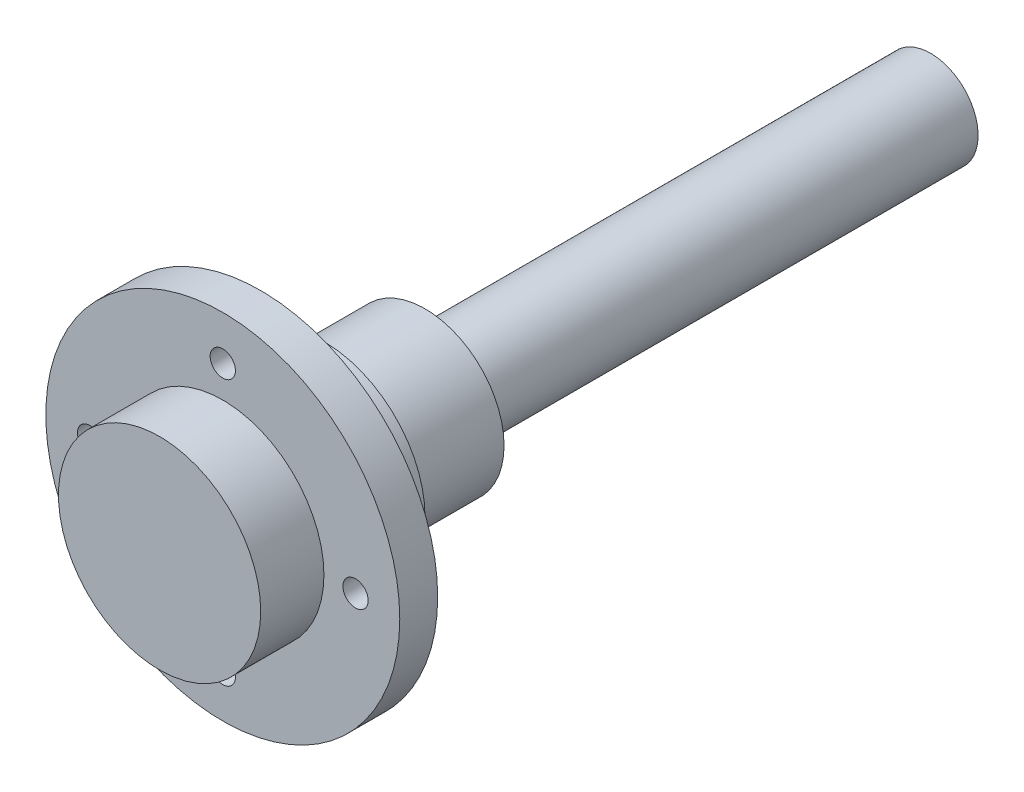
ISO-10303-21;
HEADER;
FILE_DESCRIPTION(('STEP AP214'),'2;1');
FILE_NAME('part.step','',(''),(''),'','','');
FILE_SCHEMA(('AUTOMOTIVE_DESIGN { 1 0 10303 214 1 1 1 1 }'));
ENDSEC;
DATA;
#1=APPLICATION_CONTEXT('core data for automotive mechanical design processes');
#2=APPLICATION_PROTOCOL_DEFINITION('international standard','automotive_design',2000,#1);
#3=PRODUCT_CONTEXT('',#1,'mechanical');
#4=PRODUCT('Part','Part','',(#3));
#5=PRODUCT_RELATED_PRODUCT_CATEGORY('part','',(#4));
#6=PRODUCT_DEFINITION_FORMATION('','',#4);
#7=PRODUCT_DEFINITION_CONTEXT('part definition',#1,'design');
#8=PRODUCT_DEFINITION('design','',#6,#7);
#9=PRODUCT_DEFINITION_SHAPE('','',#8);
#10=(LENGTH_UNIT() NAMED_UNIT(*) SI_UNIT(.MILLI.,.METRE.));
#11=(NAMED_UNIT(*) PLANE_ANGLE_UNIT() SI_UNIT($,.RADIAN.));
#12=(NAMED_UNIT(*) SI_UNIT($,.STERADIAN.) SOLID_ANGLE_UNIT());
#13=UNCERTAINTY_MEASURE_WITH_UNIT(LENGTH_MEASURE(1.E-05),#10,'distance_accuracy_value','');
#14=(GEOMETRIC_REPRESENTATION_CONTEXT(3) GLOBAL_UNCERTAINTY_ASSIGNED_CONTEXT((#13)) GLOBAL_UNIT_ASSIGNED_CONTEXT((#10,
#11,#12)) REPRESENTATION_CONTEXT('',''));
#15=CARTESIAN_POINT('',(0.,0.,0.));
#16=DIRECTION('',(0.,0.,1.));
#17=DIRECTION('',(1.,0.,0.));
#18=AXIS2_PLACEMENT_3D('',#15,#16,#17);
#19=CARTESIAN_POINT('',(0.,0.,16.));
#20=DIRECTION('',(0.,0.,-1.));
#21=DIRECTION('',(-1.,0.,0.));
#22=AXIS2_PLACEMENT_3D('',#19,#20,#21);
#23=CYLINDRICAL_SURFACE('',#22,12.5);
#24=CARTESIAN_POINT('',(0.,0.,16.));
#25=DIRECTION('',(0.,0.,1.));
#26=DIRECTION('',(1.,0.,0.));
#27=AXIS2_PLACEMENT_3D('',#24,#25,#26);
#28=CIRCLE('',#27,12.5);
#29=CARTESIAN_POINT('',(12.5,0.,16.));
#30=VERTEX_POINT('',#29);
#31=EDGE_CURVE('E47',#30,#30,#28,.T.);
#32=ORIENTED_EDGE('',*,*,#31,.F.);
#33=EDGE_LOOP('',(#32));
#34=FACE_BOUND('',#33,.T.);
#35=CARTESIAN_POINT('',(0.,0.,0.));
#36=DIRECTION('',(0.,0.,1.));
#37=DIRECTION('',(1.,0.,0.));
#38=AXIS2_PLACEMENT_3D('',#35,#36,#37);
#39=CIRCLE('',#38,12.5);
#40=CARTESIAN_POINT('',(12.5,0.,0.));
#41=VERTEX_POINT('',#40);
#42=EDGE_CURVE('E42',#41,#41,#39,.T.);
#43=ORIENTED_EDGE('',*,*,#42,.T.);
#44=EDGE_LOOP('',(#43));
#45=FACE_BOUND('',#44,.T.);
#46=ADVANCED_FACE('F39',(#34,#45),#23,.T.);
#47=CARTESIAN_POINT('',(0.,0.,0.));
#48=DIRECTION('',(0.,0.,1.));
#49=DIRECTION('',(1.,0.,0.));
#50=AXIS2_PLACEMENT_3D('',#47,#48,#49);
#51=PLANE('',#50);
#52=CARTESIAN_POINT('',(0.,0.,0.));
#53=DIRECTION('',(0.,0.,-1.));
#54=DIRECTION('',(-1.,0.,0.));
#55=AXIS2_PLACEMENT_3D('',#52,#53,#54);
#56=CIRCLE('',#55,7.5);
#57=CARTESIAN_POINT('',(-7.5,0.,0.));
#58=VERTEX_POINT('',#57);
#59=EDGE_CURVE('E10',#58,#58,#56,.T.);
#60=ORIENTED_EDGE('',*,*,#59,.F.);
#61=EDGE_LOOP('',(#60));
#62=FACE_BOUND('',#61,.T.);
#63=ORIENTED_EDGE('',*,*,#42,.F.);
#64=EDGE_LOOP('',(#63));
#65=FACE_BOUND('',#64,.T.);
#66=ADVANCED_FACE('F127',(#62,#65),#51,.F.);
#67=CARTESIAN_POINT('',(0.,0.,26.));
#68=DIRECTION('',(0.,0.,-1.));
#69=DIRECTION('',(-1.,0.,0.));
#70=AXIS2_PLACEMENT_3D('',#67,#68,#69);
#71=CYLINDRICAL_SURFACE('',#70,16.);
#72=CARTESIAN_POINT('',(0.,0.,26.));
#73=DIRECTION('',(0.,0.,1.));
#74=DIRECTION('',(1.,0.,0.));
#75=AXIS2_PLACEMENT_3D('',#72,#73,#74);
#76=CIRCLE('',#75,16.);
#77=CARTESIAN_POINT('',(16.,0.,26.));
#78=VERTEX_POINT('',#77);
#79=EDGE_CURVE('E105',#78,#78,#76,.T.);
#80=ORIENTED_EDGE('',*,*,#79,.F.);
#81=EDGE_LOOP('',(#80));
#82=FACE_BOUND('',#81,.T.);
#83=CARTESIAN_POINT('',(0.,0.,16.));
#84=DIRECTION('',(0.,0.,1.));
#85=DIRECTION('',(1.,0.,0.));
#86=AXIS2_PLACEMENT_3D('',#83,#84,#85);
#87=CIRCLE('',#86,16.);
#88=CARTESIAN_POINT('',(16.,0.,16.));
#89=VERTEX_POINT('',#88);
#90=EDGE_CURVE('E101',#89,#89,#87,.T.);
#91=ORIENTED_EDGE('',*,*,#90,.T.);
#92=EDGE_LOOP('',(#91));
#93=FACE_BOUND('',#92,.T.);
#94=ADVANCED_FACE('F113',(#82,#93),#71,.T.);
#95=CARTESIAN_POINT('',(0.,0.,16.));
#96=DIRECTION('',(0.,0.,1.));
#97=DIRECTION('',(1.,0.,0.));
#98=AXIS2_PLACEMENT_3D('',#95,#96,#97);
#99=PLANE('',#98);
#100=ORIENTED_EDGE('',*,*,#31,.T.);
#101=EDGE_LOOP('',(#100));
#102=FACE_BOUND('',#101,.T.);
#103=ORIENTED_EDGE('',*,*,#90,.F.);
#104=EDGE_LOOP('',(#103));
#105=FACE_BOUND('',#104,.T.);
#106=ADVANCED_FACE('F115',(#102,#105),#99,.F.);
#107=CARTESIAN_POINT('',(0.,0.,32.));
#108=DIRECTION('',(0.,0.,-1.));
#109=DIRECTION('',(-1.,0.,0.));
#110=AXIS2_PLACEMENT_3D('',#107,#108,#109);
#111=CYLINDRICAL_SURFACE('',#110,28.);
#112=CARTESIAN_POINT('',(0.,0.,32.));
#113=DIRECTION('',(0.,0.,1.));
#114=DIRECTION('',(1.,0.,0.));
#115=AXIS2_PLACEMENT_3D('',#112,#113,#114);
#116=CIRCLE('',#115,28.);
#117=CARTESIAN_POINT('',(28.,0.,32.));
#118=VERTEX_POINT('',#117);
#119=EDGE_CURVE('E97',#118,#118,#116,.T.);
#120=ORIENTED_EDGE('',*,*,#119,.F.);
#121=EDGE_LOOP('',(#120));
#122=FACE_BOUND('',#121,.T.);
#123=CARTESIAN_POINT('',(0.,0.,26.));
#124=DIRECTION('',(0.,0.,1.));
#125=DIRECTION('',(1.,0.,0.));
#126=AXIS2_PLACEMENT_3D('',#123,#124,#125);
#127=CIRCLE('',#126,28.);
#128=CARTESIAN_POINT('',(28.,0.,26.));
#129=VERTEX_POINT('',#128);
#130=EDGE_CURVE('E96',#129,#129,#127,.T.);
#131=ORIENTED_EDGE('',*,*,#130,.T.);
#132=EDGE_LOOP('',(#131));
#133=FACE_BOUND('',#132,.T.);
#134=ADVANCED_FACE('F117',(#122,#133),#111,.T.);
#135=CARTESIAN_POINT('',(0.,0.,32.));
#136=DIRECTION('',(0.,0.,1.));
#137=DIRECTION('',(1.,0.,0.));
#138=AXIS2_PLACEMENT_3D('',#135,#136,#137);
#139=PLANE('',#138);
#140=CARTESIAN_POINT('',(0.,0.,32.));
#141=DIRECTION('',(0.,0.,1.));
#142=DIRECTION('',(1.,0.,0.));
#143=AXIS2_PLACEMENT_3D('',#140,#141,#142);
#144=CIRCLE('',#143,16.);
#145=CARTESIAN_POINT('',(16.,0.,32.));
#146=VERTEX_POINT('',#145);
#147=EDGE_CURVE('E61',#146,#146,#144,.T.);
#148=ORIENTED_EDGE('',*,*,#147,.F.);
#149=EDGE_LOOP('',(#148));
#150=FACE_BOUND('',#149,.T.);
#151=CARTESIAN_POINT('',(-21.,0.,32.));
#152=DIRECTION('',(0.,0.,1.));
#153=DIRECTION('',(1.,0.,0.));
#154=AXIS2_PLACEMENT_3D('',#151,#152,#153);
#155=CIRCLE('',#154,2.);
#156=CARTESIAN_POINT('',(-19.,0.,32.));
#157=VERTEX_POINT('',#156);
#158=EDGE_CURVE('E84',#157,#157,#155,.T.);
#159=ORIENTED_EDGE('',*,*,#158,.F.);
#160=EDGE_LOOP('',(#159));
#161=FACE_BOUND('',#160,.T.);
#162=CARTESIAN_POINT('',(0.,-21.,32.));
#163=DIRECTION('',(0.,0.,1.));
#164=DIRECTION('',(1.,0.,0.));
#165=AXIS2_PLACEMENT_3D('',#162,#163,#164);
#166=CIRCLE('',#165,2.);
#167=CARTESIAN_POINT('',(2.,-21.,32.));
#168=VERTEX_POINT('',#167);
#169=EDGE_CURVE('E80',#168,#168,#166,.T.);
#170=ORIENTED_EDGE('',*,*,#169,.F.);
#171=EDGE_LOOP('',(#170));
#172=FACE_BOUND('',#171,.T.);
#173=CARTESIAN_POINT('',(21.,2.19963324347117E-13,32.));
#174=DIRECTION('',(0.,0.,1.));
#175=DIRECTION('',(1.,0.,0.));
#176=AXIS2_PLACEMENT_3D('',#173,#174,#175);
#177=CIRCLE('',#176,2.);
#178=CARTESIAN_POINT('',(23.,2.19963324347117E-13,32.));
#179=VERTEX_POINT('',#178);
#180=EDGE_CURVE('E69',#179,#179,#177,.T.);
#181=ORIENTED_EDGE('',*,*,#180,.F.);
#182=EDGE_LOOP('',(#181));
#183=FACE_BOUND('',#182,.T.);
#184=CARTESIAN_POINT('',(0.,21.,32.));
#185=DIRECTION('',(0.,0.,1.));
#186=DIRECTION('',(1.,0.,0.));
#187=AXIS2_PLACEMENT_3D('',#184,#185,#186);
#188=CIRCLE('',#187,2.);
#189=CARTESIAN_POINT('',(2.,21.,32.));
#190=VERTEX_POINT('',#189);
#191=EDGE_CURVE('E92',#190,#190,#188,.T.);
#192=ORIENTED_EDGE('',*,*,#191,.F.);
#193=EDGE_LOOP('',(#192));
#194=FACE_BOUND('',#193,.T.);
#195=ORIENTED_EDGE('',*,*,#119,.T.);
#196=EDGE_LOOP('',(#195));
#197=FACE_BOUND('',#196,.T.);
#198=ADVANCED_FACE('F124',(#150,#161,#172,#183,#194,#197),#139,.T.);
#199=CARTESIAN_POINT('',(0.,0.,26.));
#200=DIRECTION('',(0.,0.,1.));
#201=DIRECTION('',(1.,0.,0.));
#202=AXIS2_PLACEMENT_3D('',#199,#200,#201);
#203=PLANE('',#202);
#204=CARTESIAN_POINT('',(-21.,0.,26.));
#205=DIRECTION('',(0.,0.,-1.));
#206=DIRECTION('',(0.,-1.,0.));
#207=AXIS2_PLACEMENT_3D('',#204,#205,#206);
#208=CIRCLE('',#207,2.);
#209=CARTESIAN_POINT('',(-21.,-2.00000000000007,26.));
#210=VERTEX_POINT('',#209);
#211=EDGE_CURVE('E65',#210,#210,#208,.T.);
#212=ORIENTED_EDGE('',*,*,#211,.F.);
#213=EDGE_LOOP('',(#212));
#214=FACE_BOUND('',#213,.T.);
#215=CARTESIAN_POINT('',(0.,-21.,26.));
#216=DIRECTION('',(0.,0.,-1.));
#217=DIRECTION('',(1.,0.,0.));
#218=AXIS2_PLACEMENT_3D('',#215,#216,#217);
#219=CIRCLE('',#218,2.);
#220=CARTESIAN_POINT('',(2.,-21.,26.));
#221=VERTEX_POINT('',#220);
#222=EDGE_CURVE('E70',#221,#221,#219,.T.);
#223=ORIENTED_EDGE('',*,*,#222,.F.);
#224=EDGE_LOOP('',(#223));
#225=FACE_BOUND('',#224,.T.);
#226=CARTESIAN_POINT('',(21.,2.19963324347117E-13,26.));
#227=DIRECTION('',(0.,0.,-1.));
#228=DIRECTION('',(0.,1.,0.));
#229=AXIS2_PLACEMENT_3D('',#226,#227,#228);
#230=CIRCLE('',#229,2.);
#231=CARTESIAN_POINT('',(21.,2.00000000000022,26.));
#232=VERTEX_POINT('',#231);
#233=EDGE_CURVE('E60',#232,#232,#230,.T.);
#234=ORIENTED_EDGE('',*,*,#233,.F.);
#235=EDGE_LOOP('',(#234));
#236=FACE_BOUND('',#235,.T.);
#237=CARTESIAN_POINT('',(0.,21.,26.));
#238=DIRECTION('',(0.,0.,-1.));
#239=DIRECTION('',(-1.,0.,0.));
#240=AXIS2_PLACEMENT_3D('',#237,#238,#239);
#241=CIRCLE('',#240,2.);
#242=CARTESIAN_POINT('',(-2.,21.,26.));
#243=VERTEX_POINT('',#242);
#244=EDGE_CURVE('E88',#243,#243,#241,.T.);
#245=ORIENTED_EDGE('',*,*,#244,.F.);
#246=EDGE_LOOP('',(#245));
#247=FACE_BOUND('',#246,.T.);
#248=ORIENTED_EDGE('',*,*,#79,.T.);
#249=EDGE_LOOP('',(#248));
#250=FACE_BOUND('',#249,.T.);
#251=ORIENTED_EDGE('',*,*,#130,.F.);
#252=EDGE_LOOP('',(#251));
#253=FACE_BOUND('',#252,.T.);
#254=ADVANCED_FACE('F175',(#214,#225,#236,#247,#250,#253),#203,.F.);
#255=CARTESIAN_POINT('',(0.,21.,36.));
#256=DIRECTION('',(0.,0.,-1.));
#257=DIRECTION('',(-1.,0.,0.));
#258=AXIS2_PLACEMENT_3D('',#255,#256,#257);
#259=CYLINDRICAL_SURFACE('',#258,2.);
#260=ORIENTED_EDGE('',*,*,#191,.T.);
#261=EDGE_LOOP('',(#260));
#262=FACE_BOUND('',#261,.T.);
#263=ORIENTED_EDGE('',*,*,#244,.T.);
#264=EDGE_LOOP('',(#263));
#265=FACE_BOUND('',#264,.T.);
#266=ADVANCED_FACE('F169',(#262,#265),#259,.F.);
#267=CARTESIAN_POINT('',(21.,2.19963324347117E-13,36.));
#268=DIRECTION('',(0.,0.,-1.));
#269=DIRECTION('',(-1.,0.,0.));
#270=AXIS2_PLACEMENT_3D('',#267,#268,#269);
#271=CYLINDRICAL_SURFACE('',#270,2.);
#272=ORIENTED_EDGE('',*,*,#180,.T.);
#273=EDGE_LOOP('',(#272));
#274=FACE_BOUND('',#273,.T.);
#275=ORIENTED_EDGE('',*,*,#233,.T.);
#276=EDGE_LOOP('',(#275));
#277=FACE_BOUND('',#276,.T.);
#278=ADVANCED_FACE('F174',(#274,#277),#271,.F.);
#279=CARTESIAN_POINT('',(0.,-21.,36.));
#280=DIRECTION('',(0.,0.,-1.));
#281=DIRECTION('',(-1.,0.,0.));
#282=AXIS2_PLACEMENT_3D('',#279,#280,#281);
#283=CYLINDRICAL_SURFACE('',#282,2.);
#284=ORIENTED_EDGE('',*,*,#169,.T.);
#285=EDGE_LOOP('',(#284));
#286=FACE_BOUND('',#285,.T.);
#287=ORIENTED_EDGE('',*,*,#222,.T.);
#288=EDGE_LOOP('',(#287));
#289=FACE_BOUND('',#288,.T.);
#290=ADVANCED_FACE('F194',(#286,#289),#283,.F.);
#291=CARTESIAN_POINT('',(-21.,0.,36.));
#292=DIRECTION('',(0.,0.,-1.));
#293=DIRECTION('',(-1.,0.,0.));
#294=AXIS2_PLACEMENT_3D('',#291,#292,#293);
#295=CYLINDRICAL_SURFACE('',#294,2.);
#296=ORIENTED_EDGE('',*,*,#158,.T.);
#297=EDGE_LOOP('',(#296));
#298=FACE_BOUND('',#297,.T.);
#299=ORIENTED_EDGE('',*,*,#211,.T.);
#300=EDGE_LOOP('',(#299));
#301=FACE_BOUND('',#300,.T.);
#302=ADVANCED_FACE('F204',(#298,#301),#295,.F.);
#303=CARTESIAN_POINT('',(0.,0.,42.));
#304=DIRECTION('',(0.,0.,-1.));
#305=DIRECTION('',(-1.,0.,0.));
#306=AXIS2_PLACEMENT_3D('',#303,#304,#305);
#307=CYLINDRICAL_SURFACE('',#306,16.);
#308=CARTESIAN_POINT('',(0.,0.,42.));
#309=DIRECTION('',(0.,0.,1.));
#310=DIRECTION('',(1.,0.,0.));
#311=AXIS2_PLACEMENT_3D('',#308,#309,#310);
#312=CIRCLE('',#311,16.);
#313=CARTESIAN_POINT('',(16.,0.,42.));
#314=VERTEX_POINT('',#313);
#315=EDGE_CURVE('E56',#314,#314,#312,.T.);
#316=ORIENTED_EDGE('',*,*,#315,.F.);
#317=EDGE_LOOP('',(#316));
#318=FACE_BOUND('',#317,.T.);
#319=ORIENTED_EDGE('',*,*,#147,.T.);
#320=EDGE_LOOP('',(#319));
#321=FACE_BOUND('',#320,.T.);
#322=ADVANCED_FACE('F214',(#318,#321),#307,.T.);
#323=CARTESIAN_POINT('',(0.,0.,42.));
#324=DIRECTION('',(0.,0.,1.));
#325=DIRECTION('',(1.,0.,0.));
#326=AXIS2_PLACEMENT_3D('',#323,#324,#325);
#327=PLANE('',#326);
#328=ORIENTED_EDGE('',*,*,#315,.T.);
#329=EDGE_LOOP('',(#328));
#330=FACE_BOUND('',#329,.T.);
#331=ADVANCED_FACE('F230',(#330),#327,.T.);
#332=CARTESIAN_POINT('',(0.,0.,-80.));
#333=DIRECTION('',(0.,0.,1.));
#334=DIRECTION('',(1.,0.,0.));
#335=AXIS2_PLACEMENT_3D('',#332,#333,#334);
#336=CYLINDRICAL_SURFACE('',#335,7.5);
#337=CARTESIAN_POINT('',(0.,0.,-80.));
#338=DIRECTION('',(0.,0.,-1.));
#339=DIRECTION('',(-1.,0.,0.));
#340=AXIS2_PLACEMENT_3D('',#337,#338,#339);
#341=CIRCLE('',#340,7.5);
#342=CARTESIAN_POINT('',(-7.5,0.,-80.));
#343=VERTEX_POINT('',#342);
#344=EDGE_CURVE('E55',#343,#343,#341,.T.);
#345=ORIENTED_EDGE('',*,*,#344,.F.);
#346=EDGE_LOOP('',(#345));
#347=FACE_BOUND('',#346,.T.);
#348=ORIENTED_EDGE('',*,*,#59,.T.);
#349=EDGE_LOOP('',(#348));
#350=FACE_BOUND('',#349,.T.);
#351=ADVANCED_FACE('F239',(#347,#350),#336,.T.);
#352=CARTESIAN_POINT('',(0.,0.,-80.));
#353=DIRECTION('',(0.,0.,-1.));
#354=DIRECTION('',(-1.,0.,0.));
#355=AXIS2_PLACEMENT_3D('',#352,#353,#354);
#356=PLANE('',#355);
#357=ORIENTED_EDGE('',*,*,#344,.T.);
#358=EDGE_LOOP('',(#357));
#359=FACE_BOUND('',#358,.T.);
#360=ADVANCED_FACE('F249',(#359),#356,.T.);
#361=CLOSED_SHELL('',(#46,#66,#94,#106,#134,#198,#254,#266,#278,#290,#302,#322,#331,#351,#360));
#362=MANIFOLD_SOLID_BREP('B2',#361);
#363=ADVANCED_BREP_SHAPE_REPRESENTATION('',(#18,#362),#14);
#364=SHAPE_DEFINITION_REPRESENTATION(#9,#363);
ENDSEC;
END-ISO-10303-21;
